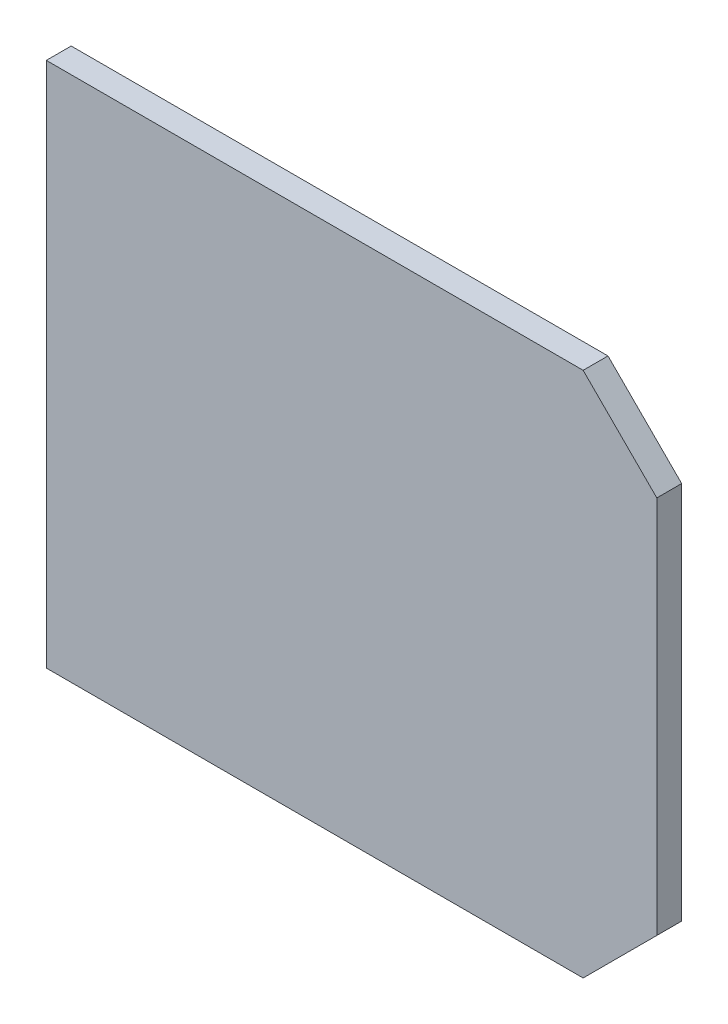
ISO-10303-21;
HEADER;
FILE_DESCRIPTION(('STEP AP214'),'2;1');
FILE_NAME('part.step','',(''),(''),'','','');
FILE_SCHEMA(('AUTOMOTIVE_DESIGN { 1 0 10303 214 1 1 1 1 }'));
ENDSEC;
DATA;
#1=APPLICATION_CONTEXT('core data for automotive mechanical design processes');
#2=APPLICATION_PROTOCOL_DEFINITION('international standard','automotive_design',2000,#1);
#3=PRODUCT_CONTEXT('',#1,'mechanical');
#4=PRODUCT('Part','Part','',(#3));
#5=PRODUCT_RELATED_PRODUCT_CATEGORY('part','',(#4));
#6=PRODUCT_DEFINITION_FORMATION('','',#4);
#7=PRODUCT_DEFINITION_CONTEXT('part definition',#1,'design');
#8=PRODUCT_DEFINITION('design','',#6,#7);
#9=PRODUCT_DEFINITION_SHAPE('','',#8);
#10=(LENGTH_UNIT() NAMED_UNIT(*) SI_UNIT(.MILLI.,.METRE.));
#11=(NAMED_UNIT(*) PLANE_ANGLE_UNIT() SI_UNIT($,.RADIAN.));
#12=(NAMED_UNIT(*) SI_UNIT($,.STERADIAN.) SOLID_ANGLE_UNIT());
#13=UNCERTAINTY_MEASURE_WITH_UNIT(LENGTH_MEASURE(1.E-05),#10,'distance_accuracy_value','');
#14=(GEOMETRIC_REPRESENTATION_CONTEXT(3) GLOBAL_UNCERTAINTY_ASSIGNED_CONTEXT((#13)) GLOBAL_UNIT_ASSIGNED_CONTEXT((#10,
#11,#12)) REPRESENTATION_CONTEXT('',''));
#15=CARTESIAN_POINT('',(0.,0.,0.));
#16=DIRECTION('',(0.,0.,1.));
#17=DIRECTION('',(1.,0.,0.));
#18=AXIS2_PLACEMENT_3D('',#15,#16,#17);
#19=CARTESIAN_POINT('',(-3.683,-3.175,0.2999994));
#20=DIRECTION('',(0.,0.,-1.));
#21=DIRECTION('',(-1.,0.,0.));
#22=AXIS2_PLACEMENT_3D('',#19,#20,#21);
#23=PLANE('',#22);
#24=DIRECTION('',(-0.707106781186548,-0.707106781186548,0.));
#25=VECTOR('',#24,1.);
#26=CARTESIAN_POINT('',(2.794,-3.175,0.2999994));
#27=LINE('',#26,#25);
#28=CARTESIAN_POINT('',(2.794,-3.175,0.2999994));
#29=VERTEX_POINT('',#28);
#30=CARTESIAN_POINT('',(3.683,-2.286,0.2999994));
#31=VERTEX_POINT('',#30);
#32=EDGE_CURVE('E96',#29,#31,#27,.F.);
#33=ORIENTED_EDGE('',*,*,#32,.T.);
#34=DIRECTION('',(0.,1.,0.));
#35=VECTOR('',#34,1.);
#36=CARTESIAN_POINT('',(3.683,-2.286,0.2999994));
#37=LINE('',#36,#35);
#38=CARTESIAN_POINT('',(3.683,2.286,0.2999994));
#39=VERTEX_POINT('',#38);
#40=EDGE_CURVE('E92',#31,#39,#37,.T.);
#41=ORIENTED_EDGE('',*,*,#40,.T.);
#42=DIRECTION('',(0.707106781186548,-0.707106781186548,0.));
#43=VECTOR('',#42,1.);
#44=CARTESIAN_POINT('',(3.683,2.286,0.2999994));
#45=LINE('',#44,#43);
#46=CARTESIAN_POINT('',(2.794,3.175,0.2999994));
#47=VERTEX_POINT('',#46);
#48=EDGE_CURVE('E68',#39,#47,#45,.F.);
#49=ORIENTED_EDGE('',*,*,#48,.T.);
#50=DIRECTION('',(1.,0.,0.));
#51=VECTOR('',#50,1.);
#52=CARTESIAN_POINT('',(2.794,3.175,0.2999994));
#53=LINE('',#52,#51);
#54=CARTESIAN_POINT('',(-3.683,3.175,0.2999994));
#55=VERTEX_POINT('',#54);
#56=EDGE_CURVE('E70',#47,#55,#53,.F.);
#57=ORIENTED_EDGE('',*,*,#56,.T.);
#58=DIRECTION('',(0.,1.,0.));
#59=VECTOR('',#58,1.);
#60=CARTESIAN_POINT('',(-3.683,3.175,0.2999994));
#61=LINE('',#60,#59);
#62=CARTESIAN_POINT('',(-3.683,-3.175,0.2999994));
#63=VERTEX_POINT('',#62);
#64=EDGE_CURVE('E20',#55,#63,#61,.F.);
#65=ORIENTED_EDGE('',*,*,#64,.T.);
#66=DIRECTION('',(1.,0.,0.));
#67=VECTOR('',#66,1.);
#68=CARTESIAN_POINT('',(-3.683,-3.175,0.2999994));
#69=LINE('',#68,#67);
#70=EDGE_CURVE('E101',#63,#29,#69,.T.);
#71=ORIENTED_EDGE('',*,*,#70,.T.);
#72=EDGE_LOOP('',(#33,#41,#49,#57,#65,#71));
#73=FACE_BOUND('',#72,.T.);
#74=ADVANCED_FACE('F17',(#73),#23,.F.);
#75=CARTESIAN_POINT('',(-3.683,3.175,0.));
#76=DIRECTION('',(1.,0.,0.));
#77=DIRECTION('',(0.,0.,-1.));
#78=AXIS2_PLACEMENT_3D('',#75,#76,#77);
#79=PLANE('',#78);
#80=DIRECTION('',(0.,0.,1.));
#81=VECTOR('',#80,1.);
#82=CARTESIAN_POINT('',(-3.683,-3.175,0.));
#83=LINE('',#82,#81);
#84=CARTESIAN_POINT('',(-3.683,-3.175,0.));
#85=VERTEX_POINT('',#84);
#86=EDGE_CURVE('E81',#85,#63,#83,.T.);
#87=ORIENTED_EDGE('',*,*,#86,.T.);
#88=ORIENTED_EDGE('',*,*,#64,.F.);
#89=DIRECTION('',(0.,0.,-1.));
#90=VECTOR('',#89,1.);
#91=CARTESIAN_POINT('',(-3.683,3.175,0.));
#92=LINE('',#91,#90);
#93=CARTESIAN_POINT('',(-3.683,3.175,0.));
#94=VERTEX_POINT('',#93);
#95=EDGE_CURVE('E76',#55,#94,#92,.T.);
#96=ORIENTED_EDGE('',*,*,#95,.T.);
#97=DIRECTION('',(0.,1.,0.));
#98=VECTOR('',#97,1.);
#99=CARTESIAN_POINT('',(-3.683,-3.175,0.));
#100=LINE('',#99,#98);
#101=EDGE_CURVE('E104',#85,#94,#100,.T.);
#102=ORIENTED_EDGE('',*,*,#101,.F.);
#103=EDGE_LOOP('',(#87,#88,#96,#102));
#104=FACE_BOUND('',#103,.T.);
#105=ADVANCED_FACE('F78',(#104),#79,.F.);
#106=CARTESIAN_POINT('',(2.794,3.175,0.));
#107=DIRECTION('',(0.,-1.,0.));
#108=DIRECTION('',(0.,0.,-1.));
#109=AXIS2_PLACEMENT_3D('',#106,#107,#108);
#110=PLANE('',#109);
#111=ORIENTED_EDGE('',*,*,#95,.F.);
#112=ORIENTED_EDGE('',*,*,#56,.F.);
#113=DIRECTION('',(0.,0.,1.));
#114=VECTOR('',#113,1.);
#115=CARTESIAN_POINT('',(2.794,3.175,0.));
#116=LINE('',#115,#114);
#117=CARTESIAN_POINT('',(2.794,3.175,0.));
#118=VERTEX_POINT('',#117);
#119=EDGE_CURVE('E88',#47,#118,#116,.F.);
#120=ORIENTED_EDGE('',*,*,#119,.T.);
#121=DIRECTION('',(-1.,0.,0.));
#122=VECTOR('',#121,1.);
#123=CARTESIAN_POINT('',(-3.683,3.175,0.));
#124=LINE('',#123,#122);
#125=EDGE_CURVE('E85',#94,#118,#124,.F.);
#126=ORIENTED_EDGE('',*,*,#125,.F.);
#127=EDGE_LOOP('',(#111,#112,#120,#126));
#128=FACE_BOUND('',#127,.T.);
#129=ADVANCED_FACE('F83',(#128),#110,.F.);
#130=CARTESIAN_POINT('',(3.683,2.286,0.));
#131=DIRECTION('',(-0.707106781186548,-0.707106781186548,0.));
#132=DIRECTION('',(0.707106781186548,-0.707106781186548,0.));
#133=AXIS2_PLACEMENT_3D('',#130,#131,#132);
#134=PLANE('',#133);
#135=ORIENTED_EDGE('',*,*,#119,.F.);
#136=ORIENTED_EDGE('',*,*,#48,.F.);
#137=DIRECTION('',(0.,0.,1.));
#138=VECTOR('',#137,1.);
#139=CARTESIAN_POINT('',(3.683,2.286,0.));
#140=LINE('',#139,#138);
#141=CARTESIAN_POINT('',(3.683,2.286,0.));
#142=VERTEX_POINT('',#141);
#143=EDGE_CURVE('E94',#39,#142,#140,.F.);
#144=ORIENTED_EDGE('',*,*,#143,.T.);
#145=DIRECTION('',(0.707106781186548,-0.707106781186547,0.));
#146=VECTOR('',#145,1.);
#147=CARTESIAN_POINT('',(2.794,3.175,0.));
#148=LINE('',#147,#146);
#149=EDGE_CURVE('E107',#118,#142,#148,.T.);
#150=ORIENTED_EDGE('',*,*,#149,.F.);
#151=EDGE_LOOP('',(#135,#136,#144,#150));
#152=FACE_BOUND('',#151,.T.);
#153=ADVANCED_FACE('F124',(#152),#134,.F.);
#154=CARTESIAN_POINT('',(3.683,-2.286,0.));
#155=DIRECTION('',(-1.,0.,0.));
#156=DIRECTION('',(0.,0.,1.));
#157=AXIS2_PLACEMENT_3D('',#154,#155,#156);
#158=PLANE('',#157);
#159=ORIENTED_EDGE('',*,*,#143,.F.);
#160=ORIENTED_EDGE('',*,*,#40,.F.);
#161=DIRECTION('',(0.,0.,1.));
#162=VECTOR('',#161,1.);
#163=CARTESIAN_POINT('',(3.683,-2.286,0.));
#164=LINE('',#163,#162);
#165=CARTESIAN_POINT('',(3.683,-2.286,0.));
#166=VERTEX_POINT('',#165);
#167=EDGE_CURVE('E98',#31,#166,#164,.F.);
#168=ORIENTED_EDGE('',*,*,#167,.T.);
#169=DIRECTION('',(0.,1.,0.));
#170=VECTOR('',#169,1.);
#171=CARTESIAN_POINT('',(3.683,-3.175,0.));
#172=LINE('',#171,#170);
#173=EDGE_CURVE('E110',#142,#166,#172,.F.);
#174=ORIENTED_EDGE('',*,*,#173,.F.);
#175=EDGE_LOOP('',(#159,#160,#168,#174));
#176=FACE_BOUND('',#175,.T.);
#177=ADVANCED_FACE('F122',(#176),#158,.F.);
#178=CARTESIAN_POINT('',(2.794,-3.175,0.));
#179=DIRECTION('',(-0.707106781186548,0.707106781186548,0.));
#180=DIRECTION('',(-0.707106781186548,-0.707106781186548,0.));
#181=AXIS2_PLACEMENT_3D('',#178,#179,#180);
#182=PLANE('',#181);
#183=ORIENTED_EDGE('',*,*,#167,.F.);
#184=ORIENTED_EDGE('',*,*,#32,.F.);
#185=DIRECTION('',(0.,0.,1.));
#186=VECTOR('',#185,1.);
#187=CARTESIAN_POINT('',(2.794,-3.175,0.));
#188=LINE('',#187,#186);
#189=CARTESIAN_POINT('',(2.794,-3.175,0.));
#190=VERTEX_POINT('',#189);
#191=EDGE_CURVE('E35',#29,#190,#188,.F.);
#192=ORIENTED_EDGE('',*,*,#191,.T.);
#193=DIRECTION('',(-0.707106781186548,-0.707106781186547,0.));
#194=VECTOR('',#193,1.);
#195=CARTESIAN_POINT('',(3.683,-2.286,0.));
#196=LINE('',#195,#194);
#197=EDGE_CURVE('E26',#166,#190,#196,.T.);
#198=ORIENTED_EDGE('',*,*,#197,.F.);
#199=EDGE_LOOP('',(#183,#184,#192,#198));
#200=FACE_BOUND('',#199,.T.);
#201=ADVANCED_FACE('F118',(#200),#182,.F.);
#202=CARTESIAN_POINT('',(-3.683,-3.175,0.));
#203=DIRECTION('',(0.,1.,0.));
#204=DIRECTION('',(0.,0.,1.));
#205=AXIS2_PLACEMENT_3D('',#202,#203,#204);
#206=PLANE('',#205);
#207=ORIENTED_EDGE('',*,*,#191,.F.);
#208=ORIENTED_EDGE('',*,*,#70,.F.);
#209=ORIENTED_EDGE('',*,*,#86,.F.);
#210=DIRECTION('',(-1.,0.,0.));
#211=VECTOR('',#210,1.);
#212=CARTESIAN_POINT('',(-3.683,-3.175,0.));
#213=LINE('',#212,#211);
#214=EDGE_CURVE('E11',#190,#85,#213,.T.);
#215=ORIENTED_EDGE('',*,*,#214,.F.);
#216=EDGE_LOOP('',(#207,#208,#209,#215));
#217=FACE_BOUND('',#216,.T.);
#218=ADVANCED_FACE('F127',(#217),#206,.F.);
#219=CARTESIAN_POINT('',(-3.683,-3.175,0.));
#220=DIRECTION('',(0.,0.,-1.));
#221=DIRECTION('',(-1.,0.,0.));
#222=AXIS2_PLACEMENT_3D('',#219,#220,#221);
#223=PLANE('',#222);
#224=ORIENTED_EDGE('',*,*,#197,.T.);
#225=ORIENTED_EDGE('',*,*,#214,.T.);
#226=ORIENTED_EDGE('',*,*,#101,.T.);
#227=ORIENTED_EDGE('',*,*,#125,.T.);
#228=ORIENTED_EDGE('',*,*,#149,.T.);
#229=ORIENTED_EDGE('',*,*,#173,.T.);
#230=EDGE_LOOP('',(#224,#225,#226,#227,#228,#229));
#231=FACE_BOUND('',#230,.T.);
#232=ADVANCED_FACE('F115',(#231),#223,.T.);
#233=CLOSED_SHELL('',(#74,#105,#129,#153,#177,#201,#218,#232));
#234=MANIFOLD_SOLID_BREP('B1',#233);
#235=ADVANCED_BREP_SHAPE_REPRESENTATION('',(#18,#234),#14);
#236=SHAPE_DEFINITION_REPRESENTATION(#9,#235);
ENDSEC;
END-ISO-10303-21;
